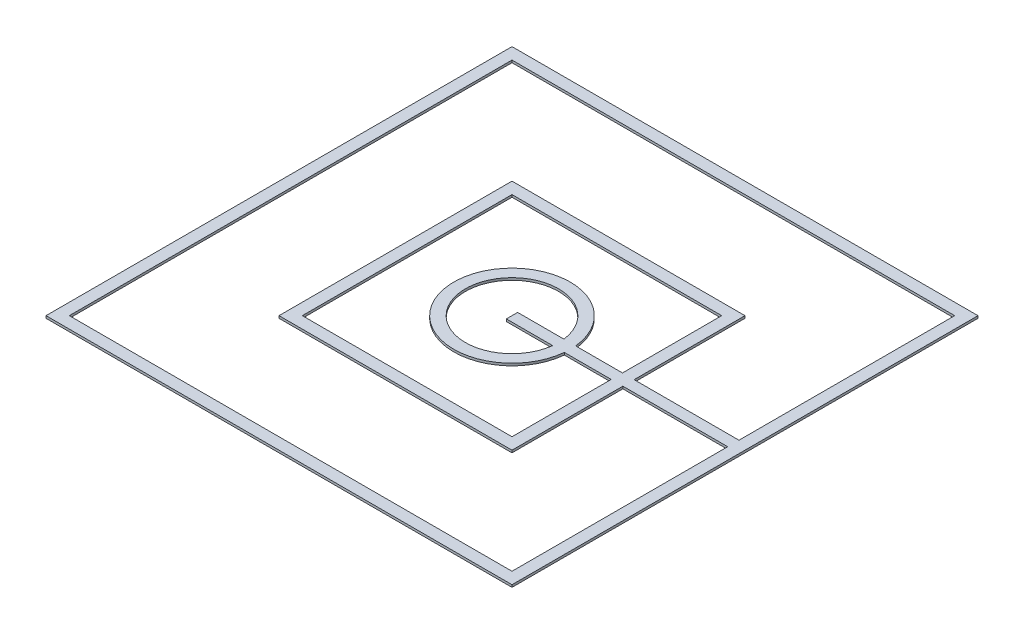
ISO-10303-21;
HEADER;
FILE_DESCRIPTION(('STEP AP214'),'2;1');
FILE_NAME('part.step','',(''),(''),'','','');
FILE_SCHEMA(('AUTOMOTIVE_DESIGN { 1 0 10303 214 1 1 1 1 }'));
ENDSEC;
DATA;
#1=APPLICATION_CONTEXT('core data for automotive mechanical design processes');
#2=APPLICATION_PROTOCOL_DEFINITION('international standard','automotive_design',2000,#1);
#3=PRODUCT_CONTEXT('',#1,'mechanical');
#4=PRODUCT('Part','Part','',(#3));
#5=PRODUCT_RELATED_PRODUCT_CATEGORY('part','',(#4));
#6=PRODUCT_DEFINITION_FORMATION('','',#4);
#7=PRODUCT_DEFINITION_CONTEXT('part definition',#1,'design');
#8=PRODUCT_DEFINITION('design','',#6,#7);
#9=PRODUCT_DEFINITION_SHAPE('','',#8);
#10=(LENGTH_UNIT() NAMED_UNIT(*) SI_UNIT(.MILLI.,.METRE.));
#11=(NAMED_UNIT(*) PLANE_ANGLE_UNIT() SI_UNIT($,.RADIAN.));
#12=(NAMED_UNIT(*) SI_UNIT($,.STERADIAN.) SOLID_ANGLE_UNIT());
#13=UNCERTAINTY_MEASURE_WITH_UNIT(LENGTH_MEASURE(1.E-05),#10,'distance_accuracy_value','');
#14=(GEOMETRIC_REPRESENTATION_CONTEXT(3) GLOBAL_UNCERTAINTY_ASSIGNED_CONTEXT((#13)) GLOBAL_UNIT_ASSIGNED_CONTEXT((#10,
#11,#12)) REPRESENTATION_CONTEXT('',''));
#15=CARTESIAN_POINT('',(0.,0.,0.));
#16=DIRECTION('',(0.,0.,1.));
#17=DIRECTION('',(1.,0.,0.));
#18=AXIS2_PLACEMENT_3D('',#15,#16,#17);
#19=CARTESIAN_POINT('',(0.,1.,-2.41786298813192));
#20=DIRECTION('',(0.,0.,-1.));
#21=DIRECTION('',(-1.,0.,0.));
#22=AXIS2_PLACEMENT_3D('',#19,#20,#21);
#23=PLANE('',#22);
#24=DIRECTION('',(1.,0.,0.));
#25=VECTOR('',#24,1.);
#26=CARTESIAN_POINT('',(0.,0.,-2.41786298813192));
#27=LINE('',#26,#25);
#28=CARTESIAN_POINT('',(24.8828040737097,0.,-2.41786298813192));
#29=VERTEX_POINT('',#28);
#30=CARTESIAN_POINT('',(45.0000000000002,0.,-2.41786298813192));
#31=VERTEX_POINT('',#30);
#32=EDGE_CURVE('E343',#29,#31,#27,.T.);
#33=ORIENTED_EDGE('',*,*,#32,.F.);
#34=DIRECTION('',(0.,-1.,0.));
#35=VECTOR('',#34,1.);
#36=CARTESIAN_POINT('',(24.8828040737097,1.,-2.41786298813192));
#37=LINE('',#36,#35);
#38=CARTESIAN_POINT('',(24.8828040737097,1.,-2.41786298813192));
#39=VERTEX_POINT('',#38);
#40=EDGE_CURVE('E11',#39,#29,#37,.T.);
#41=ORIENTED_EDGE('',*,*,#40,.F.);
#42=DIRECTION('',(1.,0.,0.));
#43=VECTOR('',#42,1.);
#44=CARTESIAN_POINT('',(0.,1.,-2.41786298813192));
#45=LINE('',#44,#43);
#46=CARTESIAN_POINT('',(45.0000000000002,1.,-2.41786298813192));
#47=VERTEX_POINT('',#46);
#48=EDGE_CURVE('E535',#39,#47,#45,.T.);
#49=ORIENTED_EDGE('',*,*,#48,.T.);
#50=DIRECTION('',(0.,-1.,0.));
#51=VECTOR('',#50,1.);
#52=CARTESIAN_POINT('',(45.0000000000002,1.,-2.41786298813192));
#53=LINE('',#52,#51);
#54=EDGE_CURVE('E155',#47,#31,#53,.T.);
#55=ORIENTED_EDGE('',*,*,#54,.T.);
#56=EDGE_LOOP('',(#33,#41,#49,#55));
#57=FACE_BOUND('',#56,.T.);
#58=ADVANCED_FACE('F41',(#57),#23,.T.);
#59=CARTESIAN_POINT('',(0.,1.,0.));
#60=DIRECTION('',(0.,-1.,0.));
#61=DIRECTION('',(0.,0.,-1.));
#62=AXIS2_PLACEMENT_3D('',#59,#60,#61);
#63=CYLINDRICAL_SURFACE('',#62,25.);
#64=CARTESIAN_POINT('',(0.,0.,0.));
#65=DIRECTION('',(0.,1.,0.));
#66=DIRECTION('',(0.,0.,1.));
#67=AXIS2_PLACEMENT_3D('',#64,#65,#66);
#68=CIRCLE('',#67,25.);
#69=CARTESIAN_POINT('',(24.8828040737097,0.,2.4178629881319));
#70=VERTEX_POINT('',#69);
#71=EDGE_CURVE('E347',#29,#70,#68,.T.);
#72=ORIENTED_EDGE('',*,*,#71,.T.);
#73=DIRECTION('',(0.,-1.,0.));
#74=VECTOR('',#73,1.);
#75=CARTESIAN_POINT('',(24.8828040737097,1.,2.4178629881319));
#76=LINE('',#75,#74);
#77=CARTESIAN_POINT('',(24.8828040737097,1.,2.4178629881319));
#78=VERTEX_POINT('',#77);
#79=EDGE_CURVE('E52',#78,#70,#76,.T.);
#80=ORIENTED_EDGE('',*,*,#79,.F.);
#81=CARTESIAN_POINT('',(0.,1.,0.));
#82=DIRECTION('',(0.,1.,0.));
#83=DIRECTION('',(0.,0.,1.));
#84=AXIS2_PLACEMENT_3D('',#81,#82,#83);
#85=CIRCLE('',#84,25.);
#86=EDGE_CURVE('E538',#39,#78,#85,.T.);
#87=ORIENTED_EDGE('',*,*,#86,.F.);
#88=ORIENTED_EDGE('',*,*,#40,.T.);
#89=EDGE_LOOP('',(#72,#80,#87,#88));
#90=FACE_BOUND('',#89,.T.);
#91=ADVANCED_FACE('F561',(#90),#63,.T.);
#92=CARTESIAN_POINT('',(0.,1.,2.41786298813192));
#93=DIRECTION('',(0.,0.,-1.));
#94=DIRECTION('',(-1.,0.,0.));
#95=AXIS2_PLACEMENT_3D('',#92,#93,#94);
#96=PLANE('',#95);
#97=DIRECTION('',(1.,0.,0.));
#98=VECTOR('',#97,1.);
#99=CARTESIAN_POINT('',(0.,0.,2.41786298813192));
#100=LINE('',#99,#98);
#101=CARTESIAN_POINT('',(45.0000000000002,0.,2.41786298813189));
#102=VERTEX_POINT('',#101);
#103=EDGE_CURVE('E351',#70,#102,#100,.T.);
#104=ORIENTED_EDGE('',*,*,#103,.T.);
#105=DIRECTION('',(0.,-1.,0.));
#106=VECTOR('',#105,1.);
#107=CARTESIAN_POINT('',(45.0000000000002,1.,2.41786298813189));
#108=LINE('',#107,#106);
#109=CARTESIAN_POINT('',(45.0000000000002,1.,2.41786298813189));
#110=VERTEX_POINT('',#109);
#111=EDGE_CURVE('E383',#110,#102,#108,.T.);
#112=ORIENTED_EDGE('',*,*,#111,.F.);
#113=DIRECTION('',(1.,0.,0.));
#114=VECTOR('',#113,1.);
#115=CARTESIAN_POINT('',(0.,1.,2.41786298813192));
#116=LINE('',#115,#114);
#117=EDGE_CURVE('E542',#78,#110,#116,.T.);
#118=ORIENTED_EDGE('',*,*,#117,.F.);
#119=ORIENTED_EDGE('',*,*,#79,.T.);
#120=EDGE_LOOP('',(#104,#112,#118,#119));
#121=FACE_BOUND('',#120,.T.);
#122=ADVANCED_FACE('F563',(#121),#96,.F.);
#123=CARTESIAN_POINT('',(45.0000000000002,1.,0.));
#124=DIRECTION('',(1.,0.,0.));
#125=DIRECTION('',(0.,0.,-1.));
#126=AXIS2_PLACEMENT_3D('',#123,#124,#125);
#127=PLANE('',#126);
#128=DIRECTION('',(0.,0.,1.));
#129=VECTOR('',#128,1.);
#130=CARTESIAN_POINT('',(45.0000000000002,0.,0.));
#131=LINE('',#130,#129);
#132=CARTESIAN_POINT('',(45.0000000000002,0.,45.0000000000001));
#133=VERTEX_POINT('',#132);
#134=EDGE_CURVE('E355',#102,#133,#131,.T.);
#135=ORIENTED_EDGE('',*,*,#134,.T.);
#136=DIRECTION('',(0.,-1.,0.));
#137=VECTOR('',#136,1.);
#138=CARTESIAN_POINT('',(45.0000000000002,1.,45.0000000000001));
#139=LINE('',#138,#137);
#140=CARTESIAN_POINT('',(45.0000000000002,1.,45.0000000000001));
#141=VERTEX_POINT('',#140);
#142=EDGE_CURVE('E379',#141,#133,#139,.T.);
#143=ORIENTED_EDGE('',*,*,#142,.F.);
#144=DIRECTION('',(0.,0.,1.));
#145=VECTOR('',#144,1.);
#146=CARTESIAN_POINT('',(45.0000000000002,1.,0.));
#147=LINE('',#146,#145);
#148=EDGE_CURVE('E546',#110,#141,#147,.T.);
#149=ORIENTED_EDGE('',*,*,#148,.F.);
#150=ORIENTED_EDGE('',*,*,#111,.T.);
#151=EDGE_LOOP('',(#135,#143,#149,#150));
#152=FACE_BOUND('',#151,.T.);
#153=ADVANCED_FACE('F552',(#152),#127,.F.);
#154=CARTESIAN_POINT('',(0.,1.,45.0000000000001));
#155=DIRECTION('',(0.,0.,1.));
#156=DIRECTION('',(1.,0.,0.));
#157=AXIS2_PLACEMENT_3D('',#154,#155,#156);
#158=PLANE('',#157);
#159=DIRECTION('',(-1.,0.,0.));
#160=VECTOR('',#159,1.);
#161=CARTESIAN_POINT('',(0.,0.,45.0000000000001));
#162=LINE('',#161,#160);
#163=CARTESIAN_POINT('',(-45.,0.,45.0000000000001));
#164=VERTEX_POINT('',#163);
#165=EDGE_CURVE('E359',#133,#164,#162,.T.);
#166=ORIENTED_EDGE('',*,*,#165,.T.);
#167=DIRECTION('',(0.,-1.,0.));
#168=VECTOR('',#167,1.);
#169=CARTESIAN_POINT('',(-45.,1.,45.0000000000001));
#170=LINE('',#169,#168);
#171=CARTESIAN_POINT('',(-45.,1.,45.0000000000001));
#172=VERTEX_POINT('',#171);
#173=EDGE_CURVE('E249',#172,#164,#170,.T.);
#174=ORIENTED_EDGE('',*,*,#173,.F.);
#175=DIRECTION('',(-1.,0.,0.));
#176=VECTOR('',#175,1.);
#177=CARTESIAN_POINT('',(0.,1.,45.0000000000001));
#178=LINE('',#177,#176);
#179=EDGE_CURVE('E254',#141,#172,#178,.T.);
#180=ORIENTED_EDGE('',*,*,#179,.F.);
#181=ORIENTED_EDGE('',*,*,#142,.T.);
#182=EDGE_LOOP('',(#166,#174,#180,#181));
#183=FACE_BOUND('',#182,.T.);
#184=ADVANCED_FACE('F554',(#183),#158,.F.);
#185=CARTESIAN_POINT('',(-45.,1.,0.));
#186=DIRECTION('',(1.,0.,0.));
#187=DIRECTION('',(0.,0.,-1.));
#188=AXIS2_PLACEMENT_3D('',#185,#186,#187);
#189=PLANE('',#188);
#190=DIRECTION('',(0.,0.,1.));
#191=VECTOR('',#190,1.);
#192=CARTESIAN_POINT('',(-45.,0.,0.));
#193=LINE('',#192,#191);
#194=CARTESIAN_POINT('',(-45.,0.,-45.0000000000001));
#195=VERTEX_POINT('',#194);
#196=EDGE_CURVE('E243',#195,#164,#193,.T.);
#197=ORIENTED_EDGE('',*,*,#196,.F.);
#198=DIRECTION('',(0.,-1.,0.));
#199=VECTOR('',#198,1.);
#200=CARTESIAN_POINT('',(-45.,1.,-45.0000000000001));
#201=LINE('',#200,#199);
#202=CARTESIAN_POINT('',(-45.,1.,-45.0000000000001));
#203=VERTEX_POINT('',#202);
#204=EDGE_CURVE('E238',#203,#195,#201,.T.);
#205=ORIENTED_EDGE('',*,*,#204,.F.);
#206=DIRECTION('',(0.,0.,1.));
#207=VECTOR('',#206,1.);
#208=CARTESIAN_POINT('',(-45.,1.,0.));
#209=LINE('',#208,#207);
#210=EDGE_CURVE('E241',#203,#172,#209,.T.);
#211=ORIENTED_EDGE('',*,*,#210,.T.);
#212=ORIENTED_EDGE('',*,*,#173,.T.);
#213=EDGE_LOOP('',(#197,#205,#211,#212));
#214=FACE_BOUND('',#213,.T.);
#215=ADVANCED_FACE('F240',(#214),#189,.T.);
#216=CARTESIAN_POINT('',(0.,1.,-45.0000000000002));
#217=DIRECTION('',(0.,0.,1.));
#218=DIRECTION('',(1.,0.,0.));
#219=AXIS2_PLACEMENT_3D('',#216,#217,#218);
#220=PLANE('',#219);
#221=DIRECTION('',(-1.,0.,0.));
#222=VECTOR('',#221,1.);
#223=CARTESIAN_POINT('',(0.,0.,-45.0000000000002));
#224=LINE('',#223,#222);
#225=CARTESIAN_POINT('',(45.0000000000002,0.,-45.0000000000002));
#226=VERTEX_POINT('',#225);
#227=EDGE_CURVE('E365',#226,#195,#224,.T.);
#228=ORIENTED_EDGE('',*,*,#227,.F.);
#229=DIRECTION('',(0.,-1.,0.));
#230=VECTOR('',#229,1.);
#231=CARTESIAN_POINT('',(45.0000000000002,1.,-45.0000000000002));
#232=LINE('',#231,#230);
#233=CARTESIAN_POINT('',(45.0000000000002,1.,-45.0000000000002));
#234=VERTEX_POINT('',#233);
#235=EDGE_CURVE('E148',#234,#226,#232,.T.);
#236=ORIENTED_EDGE('',*,*,#235,.F.);
#237=DIRECTION('',(-1.,0.,0.));
#238=VECTOR('',#237,1.);
#239=CARTESIAN_POINT('',(0.,1.,-45.0000000000002));
#240=LINE('',#239,#238);
#241=EDGE_CURVE('E252',#234,#203,#240,.T.);
#242=ORIENTED_EDGE('',*,*,#241,.T.);
#243=ORIENTED_EDGE('',*,*,#204,.T.);
#244=EDGE_LOOP('',(#228,#236,#242,#243));
#245=FACE_BOUND('',#244,.T.);
#246=ADVANCED_FACE('F258',(#245),#220,.T.);
#247=CARTESIAN_POINT('',(0.,1.,2.41786298813192));
#248=DIRECTION('',(0.,0.,-1.));
#249=DIRECTION('',(-1.,0.,0.));
#250=AXIS2_PLACEMENT_3D('',#247,#248,#249);
#251=PLANE('',#250);
#252=DIRECTION('',(1.,0.,0.));
#253=VECTOR('',#252,1.);
#254=CARTESIAN_POINT('',(0.,0.,2.41786298813192));
#255=LINE('',#254,#253);
#256=CARTESIAN_POINT('',(50.,0.,2.41786298813189));
#257=VERTEX_POINT('',#256);
#258=CARTESIAN_POINT('',(95.0000000000004,0.,2.41786298813186));
#259=VERTEX_POINT('',#258);
#260=EDGE_CURVE('E297',#257,#259,#255,.T.);
#261=ORIENTED_EDGE('',*,*,#260,.T.);
#262=DIRECTION('',(0.,-1.,0.));
#263=VECTOR('',#262,1.);
#264=CARTESIAN_POINT('',(95.0000000000004,1.,2.41786298813186));
#265=LINE('',#264,#263);
#266=CARTESIAN_POINT('',(95.0000000000004,1.,2.41786298813186));
#267=VERTEX_POINT('',#266);
#268=EDGE_CURVE('E374',#267,#259,#265,.T.);
#269=ORIENTED_EDGE('',*,*,#268,.F.);
#270=DIRECTION('',(1.,0.,0.));
#271=VECTOR('',#270,1.);
#272=CARTESIAN_POINT('',(0.,1.,2.41786298813192));
#273=LINE('',#272,#271);
#274=CARTESIAN_POINT('',(50.,1.,2.41786298813189));
#275=VERTEX_POINT('',#274);
#276=EDGE_CURVE('E492',#275,#267,#273,.T.);
#277=ORIENTED_EDGE('',*,*,#276,.F.);
#278=DIRECTION('',(0.,-1.,0.));
#279=VECTOR('',#278,1.);
#280=CARTESIAN_POINT('',(50.,1.,2.41786298813189));
#281=LINE('',#280,#279);
#282=EDGE_CURVE('E390',#275,#257,#281,.T.);
#283=ORIENTED_EDGE('',*,*,#282,.T.);
#284=EDGE_LOOP('',(#261,#269,#277,#283));
#285=FACE_BOUND('',#284,.T.);
#286=ADVANCED_FACE('F622',(#285),#251,.F.);
#287=CARTESIAN_POINT('',(95.0000000000004,1.,0.));
#288=DIRECTION('',(1.,0.,0.));
#289=DIRECTION('',(0.,0.,-1.));
#290=AXIS2_PLACEMENT_3D('',#287,#288,#289);
#291=PLANE('',#290);
#292=DIRECTION('',(0.,0.,1.));
#293=VECTOR('',#292,1.);
#294=CARTESIAN_POINT('',(95.0000000000004,0.,0.));
#295=LINE('',#294,#293);
#296=CARTESIAN_POINT('',(95.0000000000004,0.,95.0000000000001));
#297=VERTEX_POINT('',#296);
#298=EDGE_CURVE('E301',#259,#297,#295,.T.);
#299=ORIENTED_EDGE('',*,*,#298,.T.);
#300=DIRECTION('',(0.,-1.,0.));
#301=VECTOR('',#300,1.);
#302=CARTESIAN_POINT('',(95.0000000000004,1.,95.0000000000001));
#303=LINE('',#302,#301);
#304=CARTESIAN_POINT('',(95.0000000000004,1.,95.0000000000001));
#305=VERTEX_POINT('',#304);
#306=EDGE_CURVE('E422',#305,#297,#303,.T.);
#307=ORIENTED_EDGE('',*,*,#306,.F.);
#308=DIRECTION('',(0.,0.,1.));
#309=VECTOR('',#308,1.);
#310=CARTESIAN_POINT('',(95.0000000000004,1.,0.));
#311=LINE('',#310,#309);
#312=EDGE_CURVE('E496',#267,#305,#311,.T.);
#313=ORIENTED_EDGE('',*,*,#312,.F.);
#314=ORIENTED_EDGE('',*,*,#268,.T.);
#315=EDGE_LOOP('',(#299,#307,#313,#314));
#316=FACE_BOUND('',#315,.T.);
#317=ADVANCED_FACE('F618',(#316),#291,.F.);
#318=CARTESIAN_POINT('',(0.,1.,95.0000000000001));
#319=DIRECTION('',(0.,0.,1.));
#320=DIRECTION('',(1.,0.,0.));
#321=AXIS2_PLACEMENT_3D('',#318,#319,#320);
#322=PLANE('',#321);
#323=DIRECTION('',(-1.,0.,0.));
#324=VECTOR('',#323,1.);
#325=CARTESIAN_POINT('',(0.,0.,95.0000000000001));
#326=LINE('',#325,#324);
#327=CARTESIAN_POINT('',(-95.0000000000004,0.,95.0000000000001));
#328=VERTEX_POINT('',#327);
#329=EDGE_CURVE('E304',#297,#328,#326,.T.);
#330=ORIENTED_EDGE('',*,*,#329,.T.);
#331=DIRECTION('',(0.,-1.,0.));
#332=VECTOR('',#331,1.);
#333=CARTESIAN_POINT('',(-95.0000000000004,1.,95.0000000000001));
#334=LINE('',#333,#332);
#335=CARTESIAN_POINT('',(-95.0000000000004,1.,95.0000000000001));
#336=VERTEX_POINT('',#335);
#337=EDGE_CURVE('E419',#336,#328,#334,.T.);
#338=ORIENTED_EDGE('',*,*,#337,.F.);
#339=DIRECTION('',(-1.,0.,0.));
#340=VECTOR('',#339,1.);
#341=CARTESIAN_POINT('',(0.,1.,95.0000000000001));
#342=LINE('',#341,#340);
#343=EDGE_CURVE('E499',#305,#336,#342,.T.);
#344=ORIENTED_EDGE('',*,*,#343,.F.);
#345=ORIENTED_EDGE('',*,*,#306,.T.);
#346=EDGE_LOOP('',(#330,#338,#344,#345));
#347=FACE_BOUND('',#346,.T.);
#348=ADVANCED_FACE('F614',(#347),#322,.F.);
#349=CARTESIAN_POINT('',(-95.0000000000004,1.,0.));
#350=DIRECTION('',(1.,0.,0.));
#351=DIRECTION('',(0.,0.,-1.));
#352=AXIS2_PLACEMENT_3D('',#349,#350,#351);
#353=PLANE('',#352);
#354=DIRECTION('',(0.,0.,1.));
#355=VECTOR('',#354,1.);
#356=CARTESIAN_POINT('',(-95.0000000000004,0.,0.));
#357=LINE('',#356,#355);
#358=CARTESIAN_POINT('',(-95.0000000000004,0.,-95.0000000000001));
#359=VERTEX_POINT('',#358);
#360=EDGE_CURVE('E308',#359,#328,#357,.T.);
#361=ORIENTED_EDGE('',*,*,#360,.F.);
#362=DIRECTION('',(0.,-1.,0.));
#363=VECTOR('',#362,1.);
#364=CARTESIAN_POINT('',(-95.0000000000004,1.,-95.0000000000001));
#365=LINE('',#364,#363);
#366=CARTESIAN_POINT('',(-95.0000000000004,1.,-95.0000000000001));
#367=VERTEX_POINT('',#366);
#368=EDGE_CURVE('E416',#367,#359,#365,.T.);
#369=ORIENTED_EDGE('',*,*,#368,.F.);
#370=DIRECTION('',(0.,0.,1.));
#371=VECTOR('',#370,1.);
#372=CARTESIAN_POINT('',(-95.0000000000004,1.,0.));
#373=LINE('',#372,#371);
#374=EDGE_CURVE('E502',#367,#336,#373,.T.);
#375=ORIENTED_EDGE('',*,*,#374,.T.);
#376=ORIENTED_EDGE('',*,*,#337,.T.);
#377=EDGE_LOOP('',(#361,#369,#375,#376));
#378=FACE_BOUND('',#377,.T.);
#379=ADVANCED_FACE('F610',(#378),#353,.T.);
#380=CARTESIAN_POINT('',(0.,1.,-95.0000000000001));
#381=DIRECTION('',(0.,0.,1.));
#382=DIRECTION('',(1.,0.,0.));
#383=AXIS2_PLACEMENT_3D('',#380,#381,#382);
#384=PLANE('',#383);
#385=DIRECTION('',(-1.,0.,0.));
#386=VECTOR('',#385,1.);
#387=CARTESIAN_POINT('',(0.,0.,-95.0000000000001));
#388=LINE('',#387,#386);
#389=CARTESIAN_POINT('',(95.0000000000004,0.,-95.0000000000001));
#390=VERTEX_POINT('',#389);
#391=EDGE_CURVE('E312',#390,#359,#388,.T.);
#392=ORIENTED_EDGE('',*,*,#391,.F.);
#393=DIRECTION('',(0.,-1.,0.));
#394=VECTOR('',#393,1.);
#395=CARTESIAN_POINT('',(95.0000000000004,1.,-95.0000000000001));
#396=LINE('',#395,#394);
#397=CARTESIAN_POINT('',(95.0000000000004,1.,-95.0000000000001));
#398=VERTEX_POINT('',#397);
#399=EDGE_CURVE('E413',#398,#390,#396,.T.);
#400=ORIENTED_EDGE('',*,*,#399,.F.);
#401=DIRECTION('',(-1.,0.,0.));
#402=VECTOR('',#401,1.);
#403=CARTESIAN_POINT('',(0.,1.,-95.0000000000001));
#404=LINE('',#403,#402);
#405=EDGE_CURVE('E506',#398,#367,#404,.T.);
#406=ORIENTED_EDGE('',*,*,#405,.T.);
#407=ORIENTED_EDGE('',*,*,#368,.T.);
#408=EDGE_LOOP('',(#392,#400,#406,#407));
#409=FACE_BOUND('',#408,.T.);
#410=ADVANCED_FACE('F606',(#409),#384,.T.);
#411=CARTESIAN_POINT('',(95.0000000000004,1.,0.));
#412=DIRECTION('',(1.,0.,0.));
#413=DIRECTION('',(0.,0.,-1.));
#414=AXIS2_PLACEMENT_3D('',#411,#412,#413);
#415=PLANE('',#414);
#416=DIRECTION('',(0.,0.,1.));
#417=VECTOR('',#416,1.);
#418=CARTESIAN_POINT('',(95.0000000000004,0.,0.));
#419=LINE('',#418,#417);
#420=CARTESIAN_POINT('',(95.0000000000004,0.,-2.41786298813192));
#421=VERTEX_POINT('',#420);
#422=EDGE_CURVE('E316',#390,#421,#419,.T.);
#423=ORIENTED_EDGE('',*,*,#422,.T.);
#424=DIRECTION('',(0.,-1.,0.));
#425=VECTOR('',#424,1.);
#426=CARTESIAN_POINT('',(95.0000000000004,1.,-2.41786298813192));
#427=LINE('',#426,#425);
#428=CARTESIAN_POINT('',(95.0000000000004,1.,-2.41786298813192));
#429=VERTEX_POINT('',#428);
#430=EDGE_CURVE('E410',#429,#421,#427,.T.);
#431=ORIENTED_EDGE('',*,*,#430,.F.);
#432=DIRECTION('',(0.,0.,1.));
#433=VECTOR('',#432,1.);
#434=CARTESIAN_POINT('',(95.0000000000004,1.,0.));
#435=LINE('',#434,#433);
#436=EDGE_CURVE('E510',#398,#429,#435,.T.);
#437=ORIENTED_EDGE('',*,*,#436,.F.);
#438=ORIENTED_EDGE('',*,*,#399,.T.);
#439=EDGE_LOOP('',(#423,#431,#437,#438));
#440=FACE_BOUND('',#439,.T.);
#441=ADVANCED_FACE('F602',(#440),#415,.F.);
#442=CARTESIAN_POINT('',(0.,1.,-2.41786298813192));
#443=DIRECTION('',(0.,0.,-1.));
#444=DIRECTION('',(-1.,0.,0.));
#445=AXIS2_PLACEMENT_3D('',#442,#443,#444);
#446=PLANE('',#445);
#447=DIRECTION('',(1.,0.,0.));
#448=VECTOR('',#447,1.);
#449=CARTESIAN_POINT('',(0.,0.,-2.41786298813192));
#450=LINE('',#449,#448);
#451=CARTESIAN_POINT('',(50.,0.,-2.41786298813192));
#452=VERTEX_POINT('',#451);
#453=EDGE_CURVE('E320',#452,#421,#450,.T.);
#454=ORIENTED_EDGE('',*,*,#453,.F.);
#455=DIRECTION('',(0.,-1.,0.));
#456=VECTOR('',#455,1.);
#457=CARTESIAN_POINT('',(50.,1.,-2.41786298813192));
#458=LINE('',#457,#456);
#459=CARTESIAN_POINT('',(50.,1.,-2.41786298813192));
#460=VERTEX_POINT('',#459);
#461=EDGE_CURVE('E407',#460,#452,#458,.T.);
#462=ORIENTED_EDGE('',*,*,#461,.F.);
#463=DIRECTION('',(1.,0.,0.));
#464=VECTOR('',#463,1.);
#465=CARTESIAN_POINT('',(0.,1.,-2.41786298813192));
#466=LINE('',#465,#464);
#467=EDGE_CURVE('E513',#460,#429,#466,.T.);
#468=ORIENTED_EDGE('',*,*,#467,.T.);
#469=ORIENTED_EDGE('',*,*,#430,.T.);
#470=EDGE_LOOP('',(#454,#462,#468,#469));
#471=FACE_BOUND('',#470,.T.);
#472=ADVANCED_FACE('F598',(#471),#446,.T.);
#473=CARTESIAN_POINT('',(50.,1.,0.));
#474=DIRECTION('',(1.,0.,0.));
#475=DIRECTION('',(0.,0.,-1.));
#476=AXIS2_PLACEMENT_3D('',#473,#474,#475);
#477=PLANE('',#476);
#478=DIRECTION('',(0.,0.,1.));
#479=VECTOR('',#478,1.);
#480=CARTESIAN_POINT('',(50.,0.,0.));
#481=LINE('',#480,#479);
#482=CARTESIAN_POINT('',(50.,0.,-50.0000000000001));
#483=VERTEX_POINT('',#482);
#484=EDGE_CURVE('E324',#483,#452,#481,.T.);
#485=ORIENTED_EDGE('',*,*,#484,.F.);
#486=DIRECTION('',(0.,-1.,0.));
#487=VECTOR('',#486,1.);
#488=CARTESIAN_POINT('',(50.,1.,-50.0000000000001));
#489=LINE('',#488,#487);
#490=CARTESIAN_POINT('',(50.,1.,-50.0000000000001));
#491=VERTEX_POINT('',#490);
#492=EDGE_CURVE('E404',#491,#483,#489,.T.);
#493=ORIENTED_EDGE('',*,*,#492,.F.);
#494=DIRECTION('',(0.,0.,1.));
#495=VECTOR('',#494,1.);
#496=CARTESIAN_POINT('',(50.,1.,0.));
#497=LINE('',#496,#495);
#498=EDGE_CURVE('E517',#491,#460,#497,.T.);
#499=ORIENTED_EDGE('',*,*,#498,.T.);
#500=ORIENTED_EDGE('',*,*,#461,.T.);
#501=EDGE_LOOP('',(#485,#493,#499,#500));
#502=FACE_BOUND('',#501,.T.);
#503=ADVANCED_FACE('F594',(#502),#477,.T.);
#504=CARTESIAN_POINT('',(0.,1.,-50.0000000000001));
#505=DIRECTION('',(0.,0.,1.));
#506=DIRECTION('',(1.,0.,0.));
#507=AXIS2_PLACEMENT_3D('',#504,#505,#506);
#508=PLANE('',#507);
#509=DIRECTION('',(-1.,0.,0.));
#510=VECTOR('',#509,1.);
#511=CARTESIAN_POINT('',(0.,0.,-50.0000000000001));
#512=LINE('',#511,#510);
#513=CARTESIAN_POINT('',(-50.,0.,-50.0000000000001));
#514=VERTEX_POINT('',#513);
#515=EDGE_CURVE('E328',#483,#514,#512,.T.);
#516=ORIENTED_EDGE('',*,*,#515,.T.);
#517=DIRECTION('',(0.,-1.,0.));
#518=VECTOR('',#517,1.);
#519=CARTESIAN_POINT('',(-50.,1.,-50.0000000000001));
#520=LINE('',#519,#518);
#521=CARTESIAN_POINT('',(-50.,1.,-50.0000000000001));
#522=VERTEX_POINT('',#521);
#523=EDGE_CURVE('E400',#522,#514,#520,.T.);
#524=ORIENTED_EDGE('',*,*,#523,.F.);
#525=DIRECTION('',(-1.,0.,0.));
#526=VECTOR('',#525,1.);
#527=CARTESIAN_POINT('',(0.,1.,-50.0000000000001));
#528=LINE('',#527,#526);
#529=EDGE_CURVE('E521',#491,#522,#528,.T.);
#530=ORIENTED_EDGE('',*,*,#529,.F.);
#531=ORIENTED_EDGE('',*,*,#492,.T.);
#532=EDGE_LOOP('',(#516,#524,#530,#531));
#533=FACE_BOUND('',#532,.T.);
#534=ADVANCED_FACE('F590',(#533),#508,.F.);
#535=CARTESIAN_POINT('',(-50.,1.,0.));
#536=DIRECTION('',(1.,0.,0.));
#537=DIRECTION('',(0.,0.,-1.));
#538=AXIS2_PLACEMENT_3D('',#535,#536,#537);
#539=PLANE('',#538);
#540=DIRECTION('',(0.,0.,1.));
#541=VECTOR('',#540,1.);
#542=CARTESIAN_POINT('',(-50.,0.,0.));
#543=LINE('',#542,#541);
#544=CARTESIAN_POINT('',(-50.,0.,50.));
#545=VERTEX_POINT('',#544);
#546=EDGE_CURVE('E331',#514,#545,#543,.T.);
#547=ORIENTED_EDGE('',*,*,#546,.T.);
#548=DIRECTION('',(0.,-1.,0.));
#549=VECTOR('',#548,1.);
#550=CARTESIAN_POINT('',(-50.,1.,50.));
#551=LINE('',#550,#549);
#552=CARTESIAN_POINT('',(-50.,1.,50.));
#553=VERTEX_POINT('',#552);
#554=EDGE_CURVE('E397',#553,#545,#551,.T.);
#555=ORIENTED_EDGE('',*,*,#554,.F.);
#556=DIRECTION('',(0.,0.,1.));
#557=VECTOR('',#556,1.);
#558=CARTESIAN_POINT('',(-50.,1.,0.));
#559=LINE('',#558,#557);
#560=EDGE_CURVE('E524',#522,#553,#559,.T.);
#561=ORIENTED_EDGE('',*,*,#560,.F.);
#562=ORIENTED_EDGE('',*,*,#523,.T.);
#563=EDGE_LOOP('',(#547,#555,#561,#562));
#564=FACE_BOUND('',#563,.T.);
#565=ADVANCED_FACE('F586',(#564),#539,.F.);
#566=CARTESIAN_POINT('',(0.,1.,50.));
#567=DIRECTION('',(0.,0.,1.));
#568=DIRECTION('',(1.,0.,0.));
#569=AXIS2_PLACEMENT_3D('',#566,#567,#568);
#570=PLANE('',#569);
#571=DIRECTION('',(-1.,0.,0.));
#572=VECTOR('',#571,1.);
#573=CARTESIAN_POINT('',(0.,0.,50.));
#574=LINE('',#573,#572);
#575=CARTESIAN_POINT('',(50.,0.,50.));
#576=VERTEX_POINT('',#575);
#577=EDGE_CURVE('E335',#576,#545,#574,.T.);
#578=ORIENTED_EDGE('',*,*,#577,.F.);
#579=DIRECTION('',(0.,-1.,0.));
#580=VECTOR('',#579,1.);
#581=CARTESIAN_POINT('',(50.,1.,50.));
#582=LINE('',#581,#580);
#583=CARTESIAN_POINT('',(50.,1.,50.));
#584=VERTEX_POINT('',#583);
#585=EDGE_CURVE('E393',#584,#576,#582,.T.);
#586=ORIENTED_EDGE('',*,*,#585,.F.);
#587=DIRECTION('',(-1.,0.,0.));
#588=VECTOR('',#587,1.);
#589=CARTESIAN_POINT('',(0.,1.,50.));
#590=LINE('',#589,#588);
#591=EDGE_CURVE('E527',#584,#553,#590,.T.);
#592=ORIENTED_EDGE('',*,*,#591,.T.);
#593=ORIENTED_EDGE('',*,*,#554,.T.);
#594=EDGE_LOOP('',(#578,#586,#592,#593));
#595=FACE_BOUND('',#594,.T.);
#596=ADVANCED_FACE('F582',(#595),#570,.T.);
#597=CARTESIAN_POINT('',(0.,1.,-100.));
#598=DIRECTION('',(0.,0.,1.));
#599=DIRECTION('',(1.,0.,0.));
#600=AXIS2_PLACEMENT_3D('',#597,#598,#599);
#601=PLANE('',#600);
#602=DIRECTION('',(-1.,0.,0.));
#603=VECTOR('',#602,1.);
#604=CARTESIAN_POINT('',(0.,0.,-100.));
#605=LINE('',#604,#603);
#606=CARTESIAN_POINT('',(100.,0.,-100.));
#607=VERTEX_POINT('',#606);
#608=CARTESIAN_POINT('',(-100.,0.,-100.));
#609=VERTEX_POINT('',#608);
#610=EDGE_CURVE('E281',#607,#609,#605,.T.);
#611=ORIENTED_EDGE('',*,*,#610,.T.);
#612=DIRECTION('',(0.,-1.,0.));
#613=VECTOR('',#612,1.);
#614=CARTESIAN_POINT('',(-100.,1.,-100.));
#615=LINE('',#614,#613);
#616=CARTESIAN_POINT('',(-100.,1.,-100.));
#617=VERTEX_POINT('',#616);
#618=EDGE_CURVE('E394',#617,#609,#615,.T.);
#619=ORIENTED_EDGE('',*,*,#618,.F.);
#620=DIRECTION('',(-1.,0.,0.));
#621=VECTOR('',#620,1.);
#622=CARTESIAN_POINT('',(0.,1.,-100.));
#623=LINE('',#622,#621);
#624=CARTESIAN_POINT('',(100.,1.,-100.));
#625=VERTEX_POINT('',#624);
#626=EDGE_CURVE('E471',#625,#617,#623,.T.);
#627=ORIENTED_EDGE('',*,*,#626,.F.);
#628=DIRECTION('',(0.,-1.,0.));
#629=VECTOR('',#628,1.);
#630=CARTESIAN_POINT('',(100.,1.,-100.));
#631=LINE('',#630,#629);
#632=EDGE_CURVE('E429',#625,#607,#631,.T.);
#633=ORIENTED_EDGE('',*,*,#632,.T.);
#634=EDGE_LOOP('',(#611,#619,#627,#633));
#635=FACE_BOUND('',#634,.T.);
#636=ADVANCED_FACE('F585',(#635),#601,.F.);
#637=CARTESIAN_POINT('',(-100.,1.,0.));
#638=DIRECTION('',(1.,0.,0.));
#639=DIRECTION('',(0.,0.,-1.));
#640=AXIS2_PLACEMENT_3D('',#637,#638,#639);
#641=PLANE('',#640);
#642=DIRECTION('',(0.,0.,1.));
#643=VECTOR('',#642,1.);
#644=CARTESIAN_POINT('',(-100.,0.,0.));
#645=LINE('',#644,#643);
#646=CARTESIAN_POINT('',(-100.,0.,100.));
#647=VERTEX_POINT('',#646);
#648=EDGE_CURVE('E285',#609,#647,#645,.T.);
#649=ORIENTED_EDGE('',*,*,#648,.T.);
#650=DIRECTION('',(0.,-1.,0.));
#651=VECTOR('',#650,1.);
#652=CARTESIAN_POINT('',(-100.,1.,100.));
#653=LINE('',#652,#651);
#654=CARTESIAN_POINT('',(-100.,1.,100.));
#655=VERTEX_POINT('',#654);
#656=EDGE_CURVE('E435',#655,#647,#653,.T.);
#657=ORIENTED_EDGE('',*,*,#656,.F.);
#658=DIRECTION('',(0.,0.,1.));
#659=VECTOR('',#658,1.);
#660=CARTESIAN_POINT('',(-100.,1.,0.));
#661=LINE('',#660,#659);
#662=EDGE_CURVE('E477',#617,#655,#661,.T.);
#663=ORIENTED_EDGE('',*,*,#662,.F.);
#664=ORIENTED_EDGE('',*,*,#618,.T.);
#665=EDGE_LOOP('',(#649,#657,#663,#664));
#666=FACE_BOUND('',#665,.T.);
#667=ADVANCED_FACE('F633',(#666),#641,.F.);
#668=CARTESIAN_POINT('',(0.,1.,100.));
#669=DIRECTION('',(0.,0.,1.));
#670=DIRECTION('',(1.,0.,0.));
#671=AXIS2_PLACEMENT_3D('',#668,#669,#670);
#672=PLANE('',#671);
#673=DIRECTION('',(-1.,0.,0.));
#674=VECTOR('',#673,1.);
#675=CARTESIAN_POINT('',(0.,0.,100.));
#676=LINE('',#675,#674);
#677=CARTESIAN_POINT('',(100.,0.,100.));
#678=VERTEX_POINT('',#677);
#679=EDGE_CURVE('E289',#678,#647,#676,.T.);
#680=ORIENTED_EDGE('',*,*,#679,.F.);
#681=DIRECTION('',(0.,-1.,0.));
#682=VECTOR('',#681,1.);
#683=CARTESIAN_POINT('',(100.,1.,100.));
#684=LINE('',#683,#682);
#685=CARTESIAN_POINT('',(100.,1.,100.));
#686=VERTEX_POINT('',#685);
#687=EDGE_CURVE('E432',#686,#678,#684,.T.);
#688=ORIENTED_EDGE('',*,*,#687,.F.);
#689=DIRECTION('',(-1.,0.,0.));
#690=VECTOR('',#689,1.);
#691=CARTESIAN_POINT('',(0.,1.,100.));
#692=LINE('',#691,#690);
#693=EDGE_CURVE('E484',#686,#655,#692,.T.);
#694=ORIENTED_EDGE('',*,*,#693,.T.);
#695=ORIENTED_EDGE('',*,*,#656,.T.);
#696=EDGE_LOOP('',(#680,#688,#694,#695));
#697=FACE_BOUND('',#696,.T.);
#698=ADVANCED_FACE('F630',(#697),#672,.T.);
#699=CARTESIAN_POINT('',(0.,1.,0.));
#700=DIRECTION('',(0.,-1.,0.));
#701=DIRECTION('',(0.,0.,-1.));
#702=AXIS2_PLACEMENT_3D('',#699,#700,#701);
#703=CYLINDRICAL_SURFACE('',#702,20.);
#704=CARTESIAN_POINT('',(0.,0.,0.));
#705=DIRECTION('',(0.,1.,0.));
#706=DIRECTION('',(0.,0.,1.));
#707=AXIS2_PLACEMENT_3D('',#704,#705,#706);
#708=CIRCLE('',#707,20.);
#709=CARTESIAN_POINT('',(19.8533105191709,0.,-2.41786298813192));
#710=VERTEX_POINT('',#709);
#711=CARTESIAN_POINT('',(19.8533105191709,0.,2.41786298813191));
#712=VERTEX_POINT('',#711);
#713=EDGE_CURVE('E266',#710,#712,#708,.T.);
#714=ORIENTED_EDGE('',*,*,#713,.F.);
#715=DIRECTION('',(0.,-1.,0.));
#716=VECTOR('',#715,1.);
#717=CARTESIAN_POINT('',(19.8533105191709,1.,-2.41786298813192));
#718=LINE('',#717,#716);
#719=CARTESIAN_POINT('',(19.8533105191709,1.,-2.41786298813192));
#720=VERTEX_POINT('',#719);
#721=EDGE_CURVE('E45',#720,#710,#718,.T.);
#722=ORIENTED_EDGE('',*,*,#721,.F.);
#723=CARTESIAN_POINT('',(0.,1.,0.));
#724=DIRECTION('',(0.,1.,0.));
#725=DIRECTION('',(0.,0.,1.));
#726=AXIS2_PLACEMENT_3D('',#723,#724,#725);
#727=CIRCLE('',#726,20.);
#728=CARTESIAN_POINT('',(19.8533105191709,1.,2.41786298813191));
#729=VERTEX_POINT('',#728);
#730=EDGE_CURVE('E371',#720,#729,#727,.T.);
#731=ORIENTED_EDGE('',*,*,#730,.T.);
#732=DIRECTION('',(0.,-1.,0.));
#733=VECTOR('',#732,1.);
#734=CARTESIAN_POINT('',(19.8533105191709,1.,2.41786298813191));
#735=LINE('',#734,#733);
#736=EDGE_CURVE('E262',#729,#712,#735,.T.);
#737=ORIENTED_EDGE('',*,*,#736,.T.);
#738=EDGE_LOOP('',(#714,#722,#731,#737));
#739=FACE_BOUND('',#738,.T.);
#740=ADVANCED_FACE('F43',(#739),#703,.F.);
#741=CARTESIAN_POINT('',(0.,1.,-2.41786298813192));
#742=DIRECTION('',(0.,0.,-1.));
#743=DIRECTION('',(-1.,0.,0.));
#744=AXIS2_PLACEMENT_3D('',#741,#742,#743);
#745=PLANE('',#744);
#746=DIRECTION('',(1.,0.,0.));
#747=VECTOR('',#746,1.);
#748=CARTESIAN_POINT('',(0.,0.,-2.41786298813192));
#749=LINE('',#748,#747);
#750=CARTESIAN_POINT('',(0.,0.,-2.41786298813192));
#751=VERTEX_POINT('',#750);
#752=EDGE_CURVE('E270',#751,#710,#749,.T.);
#753=ORIENTED_EDGE('',*,*,#752,.F.);
#754=DIRECTION('',(0.,-1.,0.));
#755=VECTOR('',#754,1.);
#756=CARTESIAN_POINT('',(0.,1.,-2.41786298813192));
#757=LINE('',#756,#755);
#758=CARTESIAN_POINT('',(0.,1.,-2.41786298813192));
#759=VERTEX_POINT('',#758);
#760=EDGE_CURVE('E446',#759,#751,#757,.T.);
#761=ORIENTED_EDGE('',*,*,#760,.F.);
#762=DIRECTION('',(1.,0.,0.));
#763=VECTOR('',#762,1.);
#764=CARTESIAN_POINT('',(0.,1.,-2.41786298813192));
#765=LINE('',#764,#763);
#766=EDGE_CURVE('E457',#759,#720,#765,.T.);
#767=ORIENTED_EDGE('',*,*,#766,.T.);
#768=ORIENTED_EDGE('',*,*,#721,.T.);
#769=EDGE_LOOP('',(#753,#761,#767,#768));
#770=FACE_BOUND('',#769,.T.);
#771=ADVANCED_FACE('F455',(#770),#745,.T.);
#772=CARTESIAN_POINT('',(0.,1.,0.));
#773=DIRECTION('',(1.,0.,0.));
#774=DIRECTION('',(0.,0.,-1.));
#775=AXIS2_PLACEMENT_3D('',#772,#773,#774);
#776=PLANE('',#775);
#777=DIRECTION('',(0.,0.,1.));
#778=VECTOR('',#777,1.);
#779=CARTESIAN_POINT('',(0.,0.,0.));
#780=LINE('',#779,#778);
#781=CARTESIAN_POINT('',(0.,0.,2.41786298813192));
#782=VERTEX_POINT('',#781);
#783=EDGE_CURVE('E274',#751,#782,#780,.T.);
#784=ORIENTED_EDGE('',*,*,#783,.T.);
#785=DIRECTION('',(0.,-1.,0.));
#786=VECTOR('',#785,1.);
#787=CARTESIAN_POINT('',(0.,1.,2.41786298813192));
#788=LINE('',#787,#786);
#789=CARTESIAN_POINT('',(0.,1.,2.41786298813192));
#790=VERTEX_POINT('',#789);
#791=EDGE_CURVE('E443',#790,#782,#788,.T.);
#792=ORIENTED_EDGE('',*,*,#791,.F.);
#793=DIRECTION('',(0.,0.,1.));
#794=VECTOR('',#793,1.);
#795=CARTESIAN_POINT('',(0.,1.,0.));
#796=LINE('',#795,#794);
#797=EDGE_CURVE('E472',#759,#790,#796,.T.);
#798=ORIENTED_EDGE('',*,*,#797,.F.);
#799=ORIENTED_EDGE('',*,*,#760,.T.);
#800=EDGE_LOOP('',(#784,#792,#798,#799));
#801=FACE_BOUND('',#800,.T.);
#802=ADVANCED_FACE('F464',(#801),#776,.F.);
#803=CARTESIAN_POINT('',(50.,1.,0.));
#804=DIRECTION('',(1.,0.,0.));
#805=DIRECTION('',(0.,0.,-1.));
#806=AXIS2_PLACEMENT_3D('',#803,#804,#805);
#807=PLANE('',#806);
#808=DIRECTION('',(0.,0.,1.));
#809=VECTOR('',#808,1.);
#810=CARTESIAN_POINT('',(50.,0.,0.));
#811=LINE('',#810,#809);
#812=EDGE_CURVE('E339',#257,#576,#811,.T.);
#813=ORIENTED_EDGE('',*,*,#812,.F.);
#814=ORIENTED_EDGE('',*,*,#282,.F.);
#815=DIRECTION('',(0.,0.,1.));
#816=VECTOR('',#815,1.);
#817=CARTESIAN_POINT('',(50.,1.,0.));
#818=LINE('',#817,#816);
#819=EDGE_CURVE('E531',#275,#584,#818,.T.);
#820=ORIENTED_EDGE('',*,*,#819,.T.);
#821=ORIENTED_EDGE('',*,*,#585,.T.);
#822=EDGE_LOOP('',(#813,#814,#820,#821));
#823=FACE_BOUND('',#822,.T.);
#824=ADVANCED_FACE('F577',(#823),#807,.T.);
#825=CARTESIAN_POINT('',(100.,1.,0.));
#826=DIRECTION('',(1.,0.,0.));
#827=DIRECTION('',(0.,0.,-1.));
#828=AXIS2_PLACEMENT_3D('',#825,#826,#827);
#829=PLANE('',#828);
#830=DIRECTION('',(0.,0.,1.));
#831=VECTOR('',#830,1.);
#832=CARTESIAN_POINT('',(100.,0.,0.));
#833=LINE('',#832,#831);
#834=EDGE_CURVE('E293',#607,#678,#833,.T.);
#835=ORIENTED_EDGE('',*,*,#834,.F.);
#836=ORIENTED_EDGE('',*,*,#632,.F.);
#837=DIRECTION('',(0.,0.,1.));
#838=VECTOR('',#837,1.);
#839=CARTESIAN_POINT('',(100.,1.,0.));
#840=LINE('',#839,#838);
#841=EDGE_CURVE('E488',#625,#686,#840,.T.);
#842=ORIENTED_EDGE('',*,*,#841,.T.);
#843=ORIENTED_EDGE('',*,*,#687,.T.);
#844=EDGE_LOOP('',(#835,#836,#842,#843));
#845=FACE_BOUND('',#844,.T.);
#846=ADVANCED_FACE('F580',(#845),#829,.T.);
#847=CARTESIAN_POINT('',(0.,1.,2.41786298813192));
#848=DIRECTION('',(0.,0.,-1.));
#849=DIRECTION('',(-1.,0.,0.));
#850=AXIS2_PLACEMENT_3D('',#847,#848,#849);
#851=PLANE('',#850);
#852=DIRECTION('',(1.,0.,0.));
#853=VECTOR('',#852,1.);
#854=CARTESIAN_POINT('',(0.,0.,2.41786298813192));
#855=LINE('',#854,#853);
#856=EDGE_CURVE('E277',#782,#712,#855,.T.);
#857=ORIENTED_EDGE('',*,*,#856,.T.);
#858=ORIENTED_EDGE('',*,*,#736,.F.);
#859=DIRECTION('',(1.,0.,0.));
#860=VECTOR('',#859,1.);
#861=CARTESIAN_POINT('',(0.,1.,2.41786298813192));
#862=LINE('',#861,#860);
#863=EDGE_CURVE('E468',#790,#729,#862,.T.);
#864=ORIENTED_EDGE('',*,*,#863,.F.);
#865=ORIENTED_EDGE('',*,*,#791,.T.);
#866=EDGE_LOOP('',(#857,#858,#864,#865));
#867=FACE_BOUND('',#866,.T.);
#868=ADVANCED_FACE('F467',(#867),#851,.F.);
#869=CARTESIAN_POINT('',(45.0000000000002,1.,0.));
#870=DIRECTION('',(1.,0.,0.));
#871=DIRECTION('',(0.,0.,-1.));
#872=AXIS2_PLACEMENT_3D('',#869,#870,#871);
#873=PLANE('',#872);
#874=DIRECTION('',(0.,0.,1.));
#875=VECTOR('',#874,1.);
#876=CARTESIAN_POINT('',(45.0000000000002,0.,0.));
#877=LINE('',#876,#875);
#878=EDGE_CURVE('E368',#226,#31,#877,.T.);
#879=ORIENTED_EDGE('',*,*,#878,.T.);
#880=ORIENTED_EDGE('',*,*,#54,.F.);
#881=DIRECTION('',(0.,0.,1.));
#882=VECTOR('',#881,1.);
#883=CARTESIAN_POINT('',(45.0000000000002,1.,0.));
#884=LINE('',#883,#882);
#885=EDGE_CURVE('E61',#234,#47,#884,.T.);
#886=ORIENTED_EDGE('',*,*,#885,.F.);
#887=ORIENTED_EDGE('',*,*,#235,.T.);
#888=EDGE_LOOP('',(#879,#880,#886,#887));
#889=FACE_BOUND('',#888,.T.);
#890=ADVANCED_FACE('F557',(#889),#873,.F.);
#891=CARTESIAN_POINT('',(0.,1.,0.));
#892=DIRECTION('',(0.,1.,0.));
#893=DIRECTION('',(0.,0.,1.));
#894=AXIS2_PLACEMENT_3D('',#891,#892,#893);
#895=PLANE('',#894);
#896=ORIENTED_EDGE('',*,*,#730,.F.);
#897=ORIENTED_EDGE('',*,*,#766,.F.);
#898=ORIENTED_EDGE('',*,*,#797,.T.);
#899=ORIENTED_EDGE('',*,*,#863,.T.);
#900=EDGE_LOOP('',(#896,#897,#898,#899));
#901=FACE_BOUND('',#900,.T.);
#902=ORIENTED_EDGE('',*,*,#626,.T.);
#903=ORIENTED_EDGE('',*,*,#662,.T.);
#904=ORIENTED_EDGE('',*,*,#693,.F.);
#905=ORIENTED_EDGE('',*,*,#841,.F.);
#906=EDGE_LOOP('',(#902,#903,#904,#905));
#907=FACE_BOUND('',#906,.T.);
#908=ORIENTED_EDGE('',*,*,#276,.T.);
#909=ORIENTED_EDGE('',*,*,#312,.T.);
#910=ORIENTED_EDGE('',*,*,#343,.T.);
#911=ORIENTED_EDGE('',*,*,#374,.F.);
#912=ORIENTED_EDGE('',*,*,#405,.F.);
#913=ORIENTED_EDGE('',*,*,#436,.T.);
#914=ORIENTED_EDGE('',*,*,#467,.F.);
#915=ORIENTED_EDGE('',*,*,#498,.F.);
#916=ORIENTED_EDGE('',*,*,#529,.T.);
#917=ORIENTED_EDGE('',*,*,#560,.T.);
#918=ORIENTED_EDGE('',*,*,#591,.F.);
#919=ORIENTED_EDGE('',*,*,#819,.F.);
#920=EDGE_LOOP('',(#908,#909,#910,#911,#912,#913,#914,#915,#916,#917,#918,#919));
#921=FACE_BOUND('',#920,.T.);
#922=ORIENTED_EDGE('',*,*,#48,.F.);
#923=ORIENTED_EDGE('',*,*,#86,.T.);
#924=ORIENTED_EDGE('',*,*,#117,.T.);
#925=ORIENTED_EDGE('',*,*,#148,.T.);
#926=ORIENTED_EDGE('',*,*,#179,.T.);
#927=ORIENTED_EDGE('',*,*,#210,.F.);
#928=ORIENTED_EDGE('',*,*,#241,.F.);
#929=ORIENTED_EDGE('',*,*,#885,.T.);
#930=EDGE_LOOP('',(#922,#923,#924,#925,#926,#927,#928,#929));
#931=FACE_BOUND('',#930,.T.);
#932=ADVANCED_FACE('F251',(#901,#907,#921,#931),#895,.T.);
#933=CARTESIAN_POINT('',(0.,0.,0.));
#934=DIRECTION('',(0.,1.,0.));
#935=DIRECTION('',(0.,0.,1.));
#936=AXIS2_PLACEMENT_3D('',#933,#934,#935);
#937=PLANE('',#936);
#938=ORIENTED_EDGE('',*,*,#713,.T.);
#939=ORIENTED_EDGE('',*,*,#856,.F.);
#940=ORIENTED_EDGE('',*,*,#783,.F.);
#941=ORIENTED_EDGE('',*,*,#752,.T.);
#942=EDGE_LOOP('',(#938,#939,#940,#941));
#943=FACE_BOUND('',#942,.T.);
#944=ORIENTED_EDGE('',*,*,#610,.F.);
#945=ORIENTED_EDGE('',*,*,#834,.T.);
#946=ORIENTED_EDGE('',*,*,#679,.T.);
#947=ORIENTED_EDGE('',*,*,#648,.F.);
#948=EDGE_LOOP('',(#944,#945,#946,#947));
#949=FACE_BOUND('',#948,.T.);
#950=ORIENTED_EDGE('',*,*,#260,.F.);
#951=ORIENTED_EDGE('',*,*,#812,.T.);
#952=ORIENTED_EDGE('',*,*,#577,.T.);
#953=ORIENTED_EDGE('',*,*,#546,.F.);
#954=ORIENTED_EDGE('',*,*,#515,.F.);
#955=ORIENTED_EDGE('',*,*,#484,.T.);
#956=ORIENTED_EDGE('',*,*,#453,.T.);
#957=ORIENTED_EDGE('',*,*,#422,.F.);
#958=ORIENTED_EDGE('',*,*,#391,.T.);
#959=ORIENTED_EDGE('',*,*,#360,.T.);
#960=ORIENTED_EDGE('',*,*,#329,.F.);
#961=ORIENTED_EDGE('',*,*,#298,.F.);
#962=EDGE_LOOP('',(#950,#951,#952,#953,#954,#955,#956,#957,#958,#959,#960,#961));
#963=FACE_BOUND('',#962,.T.);
#964=ORIENTED_EDGE('',*,*,#32,.T.);
#965=ORIENTED_EDGE('',*,*,#878,.F.);
#966=ORIENTED_EDGE('',*,*,#227,.T.);
#967=ORIENTED_EDGE('',*,*,#196,.T.);
#968=ORIENTED_EDGE('',*,*,#165,.F.);
#969=ORIENTED_EDGE('',*,*,#134,.F.);
#970=ORIENTED_EDGE('',*,*,#103,.F.);
#971=ORIENTED_EDGE('',*,*,#71,.F.);
#972=EDGE_LOOP('',(#964,#965,#966,#967,#968,#969,#970,#971));
#973=FACE_BOUND('',#972,.T.);
#974=ADVANCED_FACE('F461',(#943,#949,#963,#973),#937,.F.);
#975=CLOSED_SHELL('',(#58,#91,#122,#153,#184,#215,#246,#286,#317,#348,#379,#410,#441,#472,#503,
#534,#565,#596,#636,#667,#698,#740,#771,#802,#824,#846,#868,#890,#932,#974));
#976=MANIFOLD_SOLID_BREP('B2',#975);
#977=ADVANCED_BREP_SHAPE_REPRESENTATION('',(#18,#976),#14);
#978=SHAPE_DEFINITION_REPRESENTATION(#9,#977);
ENDSEC;
END-ISO-10303-21;
